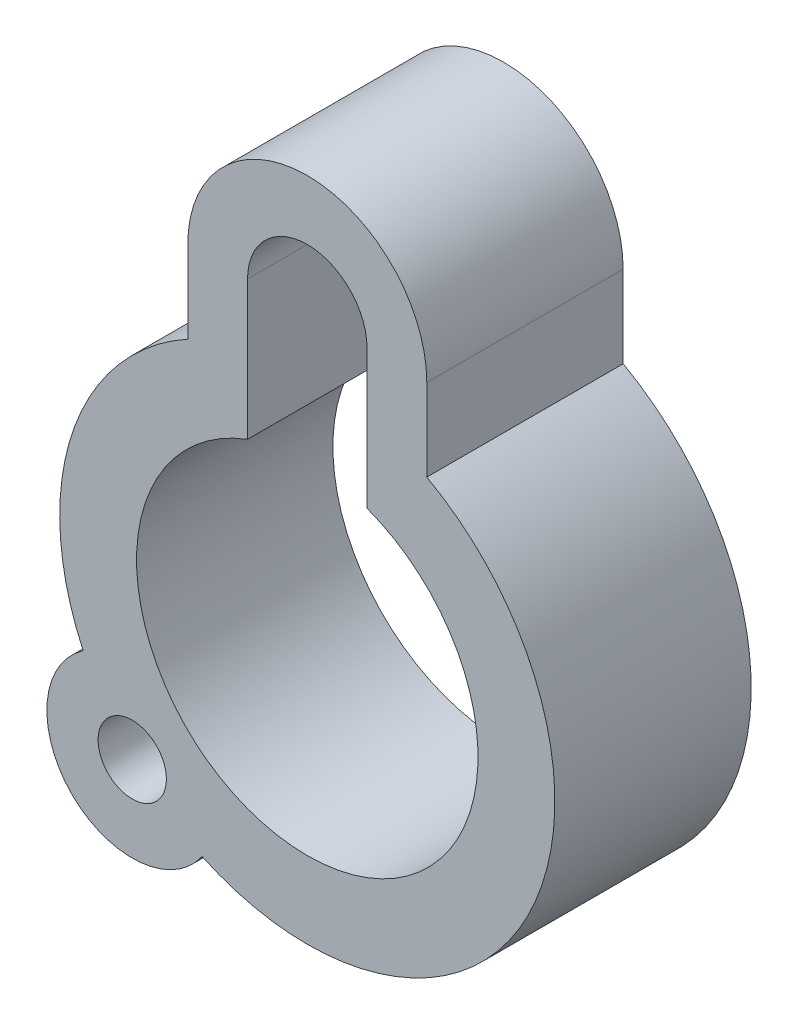
ISO-10303-21;
HEADER;
FILE_DESCRIPTION(('STEP AP214'),'2;1');
FILE_NAME('part.step','',(''),(''),'','','');
FILE_SCHEMA(('AUTOMOTIVE_DESIGN { 1 0 10303 214 1 1 1 1 }'));
ENDSEC;
DATA;
#1=APPLICATION_CONTEXT('core data for automotive mechanical design processes');
#2=APPLICATION_PROTOCOL_DEFINITION('international standard','automotive_design',2000,#1);
#3=PRODUCT_CONTEXT('',#1,'mechanical');
#4=PRODUCT('Part','Part','',(#3));
#5=PRODUCT_RELATED_PRODUCT_CATEGORY('part','',(#4));
#6=PRODUCT_DEFINITION_FORMATION('','',#4);
#7=PRODUCT_DEFINITION_CONTEXT('part definition',#1,'design');
#8=PRODUCT_DEFINITION('design','',#6,#7);
#9=PRODUCT_DEFINITION_SHAPE('','',#8);
#10=(LENGTH_UNIT() NAMED_UNIT(*) SI_UNIT(.MILLI.,.METRE.));
#11=(NAMED_UNIT(*) PLANE_ANGLE_UNIT() SI_UNIT($,.RADIAN.));
#12=(NAMED_UNIT(*) SI_UNIT($,.STERADIAN.) SOLID_ANGLE_UNIT());
#13=UNCERTAINTY_MEASURE_WITH_UNIT(LENGTH_MEASURE(1.E-05),#10,'distance_accuracy_value','');
#14=(GEOMETRIC_REPRESENTATION_CONTEXT(3) GLOBAL_UNCERTAINTY_ASSIGNED_CONTEXT((#13)) GLOBAL_UNIT_ASSIGNED_CONTEXT((#10,
#11,#12)) REPRESENTATION_CONTEXT('',''));
#15=CARTESIAN_POINT('',(0.,0.,0.));
#16=DIRECTION('',(0.,0.,1.));
#17=DIRECTION('',(1.,0.,0.));
#18=AXIS2_PLACEMENT_3D('',#15,#16,#17);
#19=CARTESIAN_POINT('',(0.,0.,23.));
#20=DIRECTION('',(0.,0.,-1.));
#21=DIRECTION('',(-1.,0.,0.));
#22=AXIS2_PLACEMENT_3D('',#19,#20,#21);
#23=CYLINDRICAL_SURFACE('',#22,20.);
#24=CARTESIAN_POINT('',(0.,0.,0.));
#25=DIRECTION('',(0.,0.,1.));
#26=DIRECTION('',(1.,0.,0.));
#27=AXIS2_PLACEMENT_3D('',#24,#25,#26);
#28=CIRCLE('',#27,20.);
#29=CARTESIAN_POINT('',(-7.,18.7349939951952,0.));
#30=VERTEX_POINT('',#29);
#31=CARTESIAN_POINT('',(7.,18.7349939951952,0.));
#32=VERTEX_POINT('',#31);
#33=EDGE_CURVE('E172',#30,#32,#28,.T.);
#34=ORIENTED_EDGE('',*,*,#33,.F.);
#35=DIRECTION('',(0.,0.,-1.));
#36=VECTOR('',#35,1.);
#37=CARTESIAN_POINT('',(-7.,18.7349939951952,23.));
#38=LINE('',#37,#36);
#39=CARTESIAN_POINT('',(-7.,18.7349939951952,23.));
#40=VERTEX_POINT('',#39);
#41=EDGE_CURVE('E13',#40,#30,#38,.T.);
#42=ORIENTED_EDGE('',*,*,#41,.F.);
#43=CARTESIAN_POINT('',(0.,0.,23.));
#44=DIRECTION('',(0.,0.,1.));
#45=DIRECTION('',(1.,0.,0.));
#46=AXIS2_PLACEMENT_3D('',#43,#44,#45);
#47=CIRCLE('',#46,20.);
#48=CARTESIAN_POINT('',(7.,18.7349939951952,23.));
#49=VERTEX_POINT('',#48);
#50=EDGE_CURVE('E138',#40,#49,#47,.T.);
#51=ORIENTED_EDGE('',*,*,#50,.T.);
#52=DIRECTION('',(0.,0.,-1.));
#53=VECTOR('',#52,1.);
#54=CARTESIAN_POINT('',(7.,18.7349939951952,23.));
#55=LINE('',#54,#53);
#56=EDGE_CURVE('E66',#49,#32,#55,.T.);
#57=ORIENTED_EDGE('',*,*,#56,.T.);
#58=EDGE_LOOP('',(#34,#42,#51,#57));
#59=FACE_BOUND('',#58,.T.);
#60=ADVANCED_FACE('F47',(#59),#23,.F.);
#61=CARTESIAN_POINT('',(-7.,0.,23.));
#62=DIRECTION('',(-1.,0.,0.));
#63=DIRECTION('',(0.,-1.,0.));
#64=AXIS2_PLACEMENT_3D('',#61,#62,#63);
#65=PLANE('',#64);
#66=DIRECTION('',(0.,1.,0.));
#67=VECTOR('',#66,1.);
#68=CARTESIAN_POINT('',(-7.,0.,0.));
#69=LINE('',#68,#67);
#70=CARTESIAN_POINT('',(-7.,35.,0.));
#71=VERTEX_POINT('',#70);
#72=EDGE_CURVE('E144',#30,#71,#69,.T.);
#73=ORIENTED_EDGE('',*,*,#72,.T.);
#74=DIRECTION('',(0.,0.,-1.));
#75=VECTOR('',#74,1.);
#76=CARTESIAN_POINT('',(-7.,35.,23.));
#77=LINE('',#76,#75);
#78=CARTESIAN_POINT('',(-7.,35.,23.));
#79=VERTEX_POINT('',#78);
#80=EDGE_CURVE('E57',#79,#71,#77,.T.);
#81=ORIENTED_EDGE('',*,*,#80,.F.);
#82=DIRECTION('',(0.,1.,0.));
#83=VECTOR('',#82,1.);
#84=CARTESIAN_POINT('',(-7.,0.,23.));
#85=LINE('',#84,#83);
#86=EDGE_CURVE('E132',#40,#79,#85,.T.);
#87=ORIENTED_EDGE('',*,*,#86,.F.);
#88=ORIENTED_EDGE('',*,*,#41,.T.);
#89=EDGE_LOOP('',(#73,#81,#87,#88));
#90=FACE_BOUND('',#89,.T.);
#91=ADVANCED_FACE('F142',(#90),#65,.F.);
#92=CARTESIAN_POINT('',(0.,35.,23.));
#93=DIRECTION('',(0.,0.,-1.));
#94=DIRECTION('',(-1.,0.,0.));
#95=AXIS2_PLACEMENT_3D('',#92,#93,#94);
#96=CYLINDRICAL_SURFACE('',#95,7.);
#97=CARTESIAN_POINT('',(0.,35.,0.));
#98=DIRECTION('',(0.,0.,1.));
#99=DIRECTION('',(1.,0.,0.));
#100=AXIS2_PLACEMENT_3D('',#97,#98,#99);
#101=CIRCLE('',#100,7.);
#102=CARTESIAN_POINT('',(7.,35.,0.));
#103=VERTEX_POINT('',#102);
#104=EDGE_CURVE('E175',#103,#71,#101,.T.);
#105=ORIENTED_EDGE('',*,*,#104,.F.);
#106=DIRECTION('',(0.,0.,-1.));
#107=VECTOR('',#106,1.);
#108=CARTESIAN_POINT('',(7.,35.,23.));
#109=LINE('',#108,#107);
#110=CARTESIAN_POINT('',(7.,35.,23.));
#111=VERTEX_POINT('',#110);
#112=EDGE_CURVE('E97',#111,#103,#109,.T.);
#113=ORIENTED_EDGE('',*,*,#112,.F.);
#114=CARTESIAN_POINT('',(0.,35.,23.));
#115=DIRECTION('',(0.,0.,1.));
#116=DIRECTION('',(1.,0.,0.));
#117=AXIS2_PLACEMENT_3D('',#114,#115,#116);
#118=CIRCLE('',#117,7.);
#119=EDGE_CURVE('E137',#111,#79,#118,.T.);
#120=ORIENTED_EDGE('',*,*,#119,.T.);
#121=ORIENTED_EDGE('',*,*,#80,.T.);
#122=EDGE_LOOP('',(#105,#113,#120,#121));
#123=FACE_BOUND('',#122,.T.);
#124=ADVANCED_FACE('F148',(#123),#96,.F.);
#125=CARTESIAN_POINT('',(-14.,0.,23.));
#126=DIRECTION('',(-1.,0.,0.));
#127=DIRECTION('',(0.,0.,1.));
#128=AXIS2_PLACEMENT_3D('',#125,#126,#127);
#129=PLANE('',#128);
#130=DIRECTION('',(0.,1.,0.));
#131=VECTOR('',#130,1.);
#132=CARTESIAN_POINT('',(-14.,0.,0.));
#133=LINE('',#132,#131);
#134=CARTESIAN_POINT('',(-14.,25.3968501984006,0.));
#135=VERTEX_POINT('',#134);
#136=CARTESIAN_POINT('',(-14.,35.,0.));
#137=VERTEX_POINT('',#136);
#138=EDGE_CURVE('E155',#135,#137,#133,.T.);
#139=ORIENTED_EDGE('',*,*,#138,.F.);
#140=DIRECTION('',(0.,0.,-1.));
#141=VECTOR('',#140,1.);
#142=CARTESIAN_POINT('',(-14.,25.3968501984006,23.));
#143=LINE('',#142,#141);
#144=CARTESIAN_POINT('',(-14.,25.3968501984006,23.));
#145=VERTEX_POINT('',#144);
#146=EDGE_CURVE('E51',#145,#135,#143,.T.);
#147=ORIENTED_EDGE('',*,*,#146,.F.);
#148=DIRECTION('',(0.,1.,0.));
#149=VECTOR('',#148,1.);
#150=CARTESIAN_POINT('',(-14.,0.,23.));
#151=LINE('',#150,#149);
#152=CARTESIAN_POINT('',(-14.,35.,23.));
#153=VERTEX_POINT('',#152);
#154=EDGE_CURVE('E180',#145,#153,#151,.T.);
#155=ORIENTED_EDGE('',*,*,#154,.T.);
#156=DIRECTION('',(0.,0.,-1.));
#157=VECTOR('',#156,1.);
#158=CARTESIAN_POINT('',(-14.,35.,23.));
#159=LINE('',#158,#157);
#160=EDGE_CURVE('E151',#153,#137,#159,.T.);
#161=ORIENTED_EDGE('',*,*,#160,.T.);
#162=EDGE_LOOP('',(#139,#147,#155,#161));
#163=FACE_BOUND('',#162,.T.);
#164=ADVANCED_FACE('F49',(#163),#129,.T.);
#165=CARTESIAN_POINT('',(0.,0.,23.));
#166=DIRECTION('',(0.,0.,-1.));
#167=DIRECTION('',(-1.,0.,0.));
#168=AXIS2_PLACEMENT_3D('',#165,#166,#167);
#169=CYLINDRICAL_SURFACE('',#168,29.);
#170=CARTESIAN_POINT('',(0.,0.,0.));
#171=DIRECTION('',(0.,0.,1.));
#172=DIRECTION('',(1.,0.,0.));
#173=AXIS2_PLACEMENT_3D('',#170,#171,#172);
#174=CIRCLE('',#173,29.);
#175=CARTESIAN_POINT('',(-26.2521228512344,-12.3217712121145,0.));
#176=VERTEX_POINT('',#175);
#177=EDGE_CURVE('E158',#135,#176,#174,.T.);
#178=ORIENTED_EDGE('',*,*,#177,.T.);
#179=DIRECTION('',(0.,0.,-1.));
#180=VECTOR('',#179,1.);
#181=CARTESIAN_POINT('',(-26.2521228512344,-12.3217712121145,23.));
#182=LINE('',#181,#180);
#183=CARTESIAN_POINT('',(-26.2521228512344,-12.3217712121145,23.));
#184=VERTEX_POINT('',#183);
#185=EDGE_CURVE('E192',#184,#176,#182,.T.);
#186=ORIENTED_EDGE('',*,*,#185,.F.);
#187=CARTESIAN_POINT('',(0.,0.,23.));
#188=DIRECTION('',(0.,0.,1.));
#189=DIRECTION('',(1.,0.,0.));
#190=AXIS2_PLACEMENT_3D('',#187,#188,#189);
#191=CIRCLE('',#190,29.);
#192=EDGE_CURVE('E201',#145,#184,#191,.T.);
#193=ORIENTED_EDGE('',*,*,#192,.F.);
#194=ORIENTED_EDGE('',*,*,#146,.T.);
#195=EDGE_LOOP('',(#178,#186,#193,#194));
#196=FACE_BOUND('',#195,.T.);
#197=ADVANCED_FACE('F200',(#196),#169,.T.);
#198=CARTESIAN_POINT('',(-20.5060966544098,-20.50609665441,23.));
#199=DIRECTION('',(0.,0.,-1.));
#200=DIRECTION('',(-1.,0.,0.));
#201=AXIS2_PLACEMENT_3D('',#198,#199,#200);
#202=CYLINDRICAL_SURFACE('',#201,10.);
#203=CARTESIAN_POINT('',(-20.5060966544098,-20.50609665441,0.));
#204=DIRECTION('',(0.,0.,1.));
#205=DIRECTION('',(1.,0.,0.));
#206=AXIS2_PLACEMENT_3D('',#203,#204,#205);
#207=CIRCLE('',#206,10.);
#208=CARTESIAN_POINT('',(-12.3217712121142,-26.2521228512346,0.));
#209=VERTEX_POINT('',#208);
#210=EDGE_CURVE('E160',#176,#209,#207,.T.);
#211=ORIENTED_EDGE('',*,*,#210,.T.);
#212=DIRECTION('',(0.,0.,-1.));
#213=VECTOR('',#212,1.);
#214=CARTESIAN_POINT('',(-12.3217712121142,-26.2521228512346,23.));
#215=LINE('',#214,#213);
#216=CARTESIAN_POINT('',(-12.3217712121142,-26.2521228512346,23.));
#217=VERTEX_POINT('',#216);
#218=EDGE_CURVE('E190',#217,#209,#215,.T.);
#219=ORIENTED_EDGE('',*,*,#218,.F.);
#220=CARTESIAN_POINT('',(-20.5060966544098,-20.50609665441,23.));
#221=DIRECTION('',(0.,0.,1.));
#222=DIRECTION('',(1.,0.,0.));
#223=AXIS2_PLACEMENT_3D('',#220,#221,#222);
#224=CIRCLE('',#223,10.);
#225=EDGE_CURVE('E225',#184,#217,#224,.T.);
#226=ORIENTED_EDGE('',*,*,#225,.F.);
#227=ORIENTED_EDGE('',*,*,#185,.T.);
#228=EDGE_LOOP('',(#211,#219,#226,#227));
#229=FACE_BOUND('',#228,.T.);
#230=ADVANCED_FACE('F224',(#229),#202,.T.);
#231=CARTESIAN_POINT('',(0.,0.,23.));
#232=DIRECTION('',(0.,0.,-1.));
#233=DIRECTION('',(-1.,0.,0.));
#234=AXIS2_PLACEMENT_3D('',#231,#232,#233);
#235=CYLINDRICAL_SURFACE('',#234,29.);
#236=CARTESIAN_POINT('',(0.,0.,0.));
#237=DIRECTION('',(0.,0.,1.));
#238=DIRECTION('',(1.,0.,0.));
#239=AXIS2_PLACEMENT_3D('',#236,#237,#238);
#240=CIRCLE('',#239,29.);
#241=CARTESIAN_POINT('',(14.,25.3968501984006,0.));
#242=VERTEX_POINT('',#241);
#243=EDGE_CURVE('E162',#209,#242,#240,.T.);
#244=ORIENTED_EDGE('',*,*,#243,.T.);
#245=DIRECTION('',(0.,0.,-1.));
#246=VECTOR('',#245,1.);
#247=CARTESIAN_POINT('',(14.,25.3968501984006,23.));
#248=LINE('',#247,#246);
#249=CARTESIAN_POINT('',(14.,25.3968501984006,23.));
#250=VERTEX_POINT('',#249);
#251=EDGE_CURVE('E187',#250,#242,#248,.T.);
#252=ORIENTED_EDGE('',*,*,#251,.F.);
#253=CARTESIAN_POINT('',(0.,0.,23.));
#254=DIRECTION('',(0.,0.,1.));
#255=DIRECTION('',(1.,0.,0.));
#256=AXIS2_PLACEMENT_3D('',#253,#254,#255);
#257=CIRCLE('',#256,29.);
#258=EDGE_CURVE('E222',#217,#250,#257,.T.);
#259=ORIENTED_EDGE('',*,*,#258,.F.);
#260=ORIENTED_EDGE('',*,*,#218,.T.);
#261=EDGE_LOOP('',(#244,#252,#259,#260));
#262=FACE_BOUND('',#261,.T.);
#263=ADVANCED_FACE('F221',(#262),#235,.T.);
#264=CARTESIAN_POINT('',(14.,0.,23.));
#265=DIRECTION('',(-1.,0.,0.));
#266=DIRECTION('',(0.,0.,1.));
#267=AXIS2_PLACEMENT_3D('',#264,#265,#266);
#268=PLANE('',#267);
#269=DIRECTION('',(0.,1.,0.));
#270=VECTOR('',#269,1.);
#271=CARTESIAN_POINT('',(14.,0.,0.));
#272=LINE('',#271,#270);
#273=CARTESIAN_POINT('',(14.,35.,0.));
#274=VERTEX_POINT('',#273);
#275=EDGE_CURVE('E164',#242,#274,#272,.T.);
#276=ORIENTED_EDGE('',*,*,#275,.T.);
#277=DIRECTION('',(0.,0.,-1.));
#278=VECTOR('',#277,1.);
#279=CARTESIAN_POINT('',(14.,35.,23.));
#280=LINE('',#279,#278);
#281=CARTESIAN_POINT('',(14.,35.,23.));
#282=VERTEX_POINT('',#281);
#283=EDGE_CURVE('E184',#282,#274,#280,.T.);
#284=ORIENTED_EDGE('',*,*,#283,.F.);
#285=DIRECTION('',(0.,1.,0.));
#286=VECTOR('',#285,1.);
#287=CARTESIAN_POINT('',(14.,0.,23.));
#288=LINE('',#287,#286);
#289=EDGE_CURVE('E218',#250,#282,#288,.T.);
#290=ORIENTED_EDGE('',*,*,#289,.F.);
#291=ORIENTED_EDGE('',*,*,#251,.T.);
#292=EDGE_LOOP('',(#276,#284,#290,#291));
#293=FACE_BOUND('',#292,.T.);
#294=ADVANCED_FACE('F215',(#293),#268,.F.);
#295=CARTESIAN_POINT('',(-20.5060966544098,-20.50609665441,23.));
#296=DIRECTION('',(0.,0.,-1.));
#297=DIRECTION('',(-1.,0.,0.));
#298=AXIS2_PLACEMENT_3D('',#295,#296,#297);
#299=CYLINDRICAL_SURFACE('',#298,4.);
#300=CARTESIAN_POINT('',(-20.5060966544098,-20.50609665441,23.));
#301=DIRECTION('',(0.,0.,1.));
#302=DIRECTION('',(1.,0.,0.));
#303=AXIS2_PLACEMENT_3D('',#300,#301,#302);
#304=CIRCLE('',#303,4.);
#305=CARTESIAN_POINT('',(-16.5060966544098,-20.50609665441,23.));
#306=VERTEX_POINT('',#305);
#307=EDGE_CURVE('E235',#306,#306,#304,.T.);
#308=ORIENTED_EDGE('',*,*,#307,.T.);
#309=EDGE_LOOP('',(#308));
#310=FACE_BOUND('',#309,.T.);
#311=CARTESIAN_POINT('',(-20.5060966544098,-20.50609665441,0.));
#312=DIRECTION('',(0.,0.,1.));
#313=DIRECTION('',(1.,0.,0.));
#314=AXIS2_PLACEMENT_3D('',#311,#312,#313);
#315=CIRCLE('',#314,4.);
#316=CARTESIAN_POINT('',(-16.5060966544098,-20.50609665441,0.));
#317=VERTEX_POINT('',#316);
#318=EDGE_CURVE('E169',#317,#317,#315,.T.);
#319=ORIENTED_EDGE('',*,*,#318,.F.);
#320=EDGE_LOOP('',(#319));
#321=FACE_BOUND('',#320,.T.);
#322=ADVANCED_FACE('F245',(#310,#321),#299,.F.);
#323=CARTESIAN_POINT('',(0.,35.,23.));
#324=DIRECTION('',(0.,0.,-1.));
#325=DIRECTION('',(-1.,0.,0.));
#326=AXIS2_PLACEMENT_3D('',#323,#324,#325);
#327=CYLINDRICAL_SURFACE('',#326,14.);
#328=CARTESIAN_POINT('',(0.,35.,0.));
#329=DIRECTION('',(0.,0.,1.));
#330=DIRECTION('',(1.,0.,0.));
#331=AXIS2_PLACEMENT_3D('',#328,#329,#330);
#332=CIRCLE('',#331,14.);
#333=EDGE_CURVE('E166',#274,#137,#332,.T.);
#334=ORIENTED_EDGE('',*,*,#333,.T.);
#335=ORIENTED_EDGE('',*,*,#160,.F.);
#336=CARTESIAN_POINT('',(0.,35.,23.));
#337=DIRECTION('',(0.,0.,1.));
#338=DIRECTION('',(1.,0.,0.));
#339=AXIS2_PLACEMENT_3D('',#336,#337,#338);
#340=CIRCLE('',#339,14.);
#341=EDGE_CURVE('E233',#282,#153,#340,.T.);
#342=ORIENTED_EDGE('',*,*,#341,.F.);
#343=ORIENTED_EDGE('',*,*,#283,.T.);
#344=EDGE_LOOP('',(#334,#335,#342,#343));
#345=FACE_BOUND('',#344,.T.);
#346=ADVANCED_FACE('F211',(#345),#327,.T.);
#347=CARTESIAN_POINT('',(7.,0.,23.));
#348=DIRECTION('',(-1.,0.,0.));
#349=DIRECTION('',(0.,-1.,0.));
#350=AXIS2_PLACEMENT_3D('',#347,#348,#349);
#351=PLANE('',#350);
#352=DIRECTION('',(0.,1.,0.));
#353=VECTOR('',#352,1.);
#354=CARTESIAN_POINT('',(7.,0.,0.));
#355=LINE('',#354,#353);
#356=EDGE_CURVE('E177',#32,#103,#355,.T.);
#357=ORIENTED_EDGE('',*,*,#356,.F.);
#358=ORIENTED_EDGE('',*,*,#56,.F.);
#359=DIRECTION('',(0.,1.,0.));
#360=VECTOR('',#359,1.);
#361=CARTESIAN_POINT('',(7.,0.,23.));
#362=LINE('',#361,#360);
#363=EDGE_CURVE('E149',#49,#111,#362,.T.);
#364=ORIENTED_EDGE('',*,*,#363,.T.);
#365=ORIENTED_EDGE('',*,*,#112,.T.);
#366=EDGE_LOOP('',(#357,#358,#364,#365));
#367=FACE_BOUND('',#366,.T.);
#368=ADVANCED_FACE('F237',(#367),#351,.T.);
#369=CARTESIAN_POINT('',(0.,0.,23.));
#370=DIRECTION('',(0.,0.,1.));
#371=DIRECTION('',(1.,0.,0.));
#372=AXIS2_PLACEMENT_3D('',#369,#370,#371);
#373=PLANE('',#372);
#374=ORIENTED_EDGE('',*,*,#154,.F.);
#375=ORIENTED_EDGE('',*,*,#192,.T.);
#376=ORIENTED_EDGE('',*,*,#225,.T.);
#377=ORIENTED_EDGE('',*,*,#258,.T.);
#378=ORIENTED_EDGE('',*,*,#289,.T.);
#379=ORIENTED_EDGE('',*,*,#341,.T.);
#380=EDGE_LOOP('',(#374,#375,#376,#377,#378,#379));
#381=FACE_BOUND('',#380,.T.);
#382=ORIENTED_EDGE('',*,*,#307,.F.);
#383=EDGE_LOOP('',(#382));
#384=FACE_BOUND('',#383,.T.);
#385=ORIENTED_EDGE('',*,*,#50,.F.);
#386=ORIENTED_EDGE('',*,*,#86,.T.);
#387=ORIENTED_EDGE('',*,*,#119,.F.);
#388=ORIENTED_EDGE('',*,*,#363,.F.);
#389=EDGE_LOOP('',(#385,#386,#387,#388));
#390=FACE_BOUND('',#389,.T.);
#391=ADVANCED_FACE('F134',(#381,#384,#390),#373,.T.);
#392=CARTESIAN_POINT('',(0.,0.,0.));
#393=DIRECTION('',(0.,0.,1.));
#394=DIRECTION('',(1.,0.,0.));
#395=AXIS2_PLACEMENT_3D('',#392,#393,#394);
#396=PLANE('',#395);
#397=ORIENTED_EDGE('',*,*,#138,.T.);
#398=ORIENTED_EDGE('',*,*,#333,.F.);
#399=ORIENTED_EDGE('',*,*,#275,.F.);
#400=ORIENTED_EDGE('',*,*,#243,.F.);
#401=ORIENTED_EDGE('',*,*,#210,.F.);
#402=ORIENTED_EDGE('',*,*,#177,.F.);
#403=EDGE_LOOP('',(#397,#398,#399,#400,#401,#402));
#404=FACE_BOUND('',#403,.T.);
#405=ORIENTED_EDGE('',*,*,#318,.T.);
#406=EDGE_LOOP('',(#405));
#407=FACE_BOUND('',#406,.T.);
#408=ORIENTED_EDGE('',*,*,#33,.T.);
#409=ORIENTED_EDGE('',*,*,#356,.T.);
#410=ORIENTED_EDGE('',*,*,#104,.T.);
#411=ORIENTED_EDGE('',*,*,#72,.F.);
#412=EDGE_LOOP('',(#408,#409,#410,#411));
#413=FACE_BOUND('',#412,.T.);
#414=ADVANCED_FACE('F204',(#404,#407,#413),#396,.F.);
#415=CLOSED_SHELL('',(#60,#91,#124,#164,#197,#230,#263,#294,#322,#346,#368,#391,#414));
#416=MANIFOLD_SOLID_BREP('B2',#415);
#417=ADVANCED_BREP_SHAPE_REPRESENTATION('',(#18,#416),#14);
#418=SHAPE_DEFINITION_REPRESENTATION(#9,#417);
ENDSEC;
END-ISO-10303-21;
